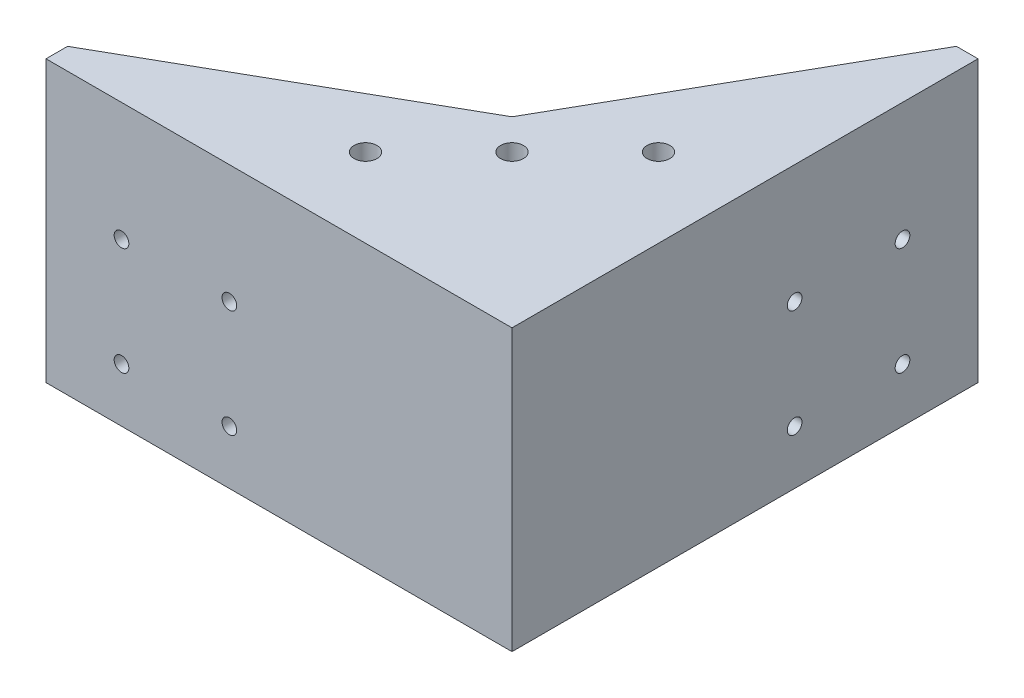
ISO-10303-21;
HEADER;
FILE_DESCRIPTION(('STEP AP214'),'2;1');
FILE_NAME('part.step','',(''),(''),'','','');
FILE_SCHEMA(('AUTOMOTIVE_DESIGN { 1 0 10303 214 1 1 1 1 }'));
ENDSEC;
DATA;
#1=APPLICATION_CONTEXT('core data for automotive mechanical design processes');
#2=APPLICATION_PROTOCOL_DEFINITION('international standard','automotive_design',2000,#1);
#3=PRODUCT_CONTEXT('',#1,'mechanical');
#4=PRODUCT('Part','Part','',(#3));
#5=PRODUCT_RELATED_PRODUCT_CATEGORY('part','',(#4));
#6=PRODUCT_DEFINITION_FORMATION('','',#4);
#7=PRODUCT_DEFINITION_CONTEXT('part definition',#1,'design');
#8=PRODUCT_DEFINITION('design','',#6,#7);
#9=PRODUCT_DEFINITION_SHAPE('','',#8);
#10=(LENGTH_UNIT() NAMED_UNIT(*) SI_UNIT(.MILLI.,.METRE.));
#11=(NAMED_UNIT(*) PLANE_ANGLE_UNIT() SI_UNIT($,.RADIAN.));
#12=(NAMED_UNIT(*) SI_UNIT($,.STERADIAN.) SOLID_ANGLE_UNIT());
#13=UNCERTAINTY_MEASURE_WITH_UNIT(LENGTH_MEASURE(1.E-05),#10,'distance_accuracy_value','');
#14=(GEOMETRIC_REPRESENTATION_CONTEXT(3) GLOBAL_UNCERTAINTY_ASSIGNED_CONTEXT((#13)) GLOBAL_UNIT_ASSIGNED_CONTEXT((#10,
#11,#12)) REPRESENTATION_CONTEXT('',''));
#15=CARTESIAN_POINT('',(0.,0.,0.));
#16=DIRECTION('',(0.,0.,1.));
#17=DIRECTION('',(1.,0.,0.));
#18=AXIS2_PLACEMENT_3D('',#15,#16,#17);
#19=CARTESIAN_POINT('',(0.,60.,49.));
#20=DIRECTION('',(0.,0.,-1.));
#21=DIRECTION('',(-1.,0.,0.));
#22=AXIS2_PLACEMENT_3D('',#19,#20,#21);
#23=PLANE('',#22);
#24=DIRECTION('',(-1.,0.,0.));
#25=VECTOR('',#24,1.);
#26=CARTESIAN_POINT('',(0.,40.,49.));
#27=LINE('',#26,#25);
#28=CARTESIAN_POINT('',(49.,40.,49.));
#29=VERTEX_POINT('',#28);
#30=CARTESIAN_POINT('',(14.,40.,49.));
#31=VERTEX_POINT('',#30);
#32=EDGE_CURVE('E160',#29,#31,#27,.T.);
#33=ORIENTED_EDGE('',*,*,#32,.F.);
#34=DIRECTION('',(0.,-1.,0.));
#35=VECTOR('',#34,1.);
#36=CARTESIAN_POINT('',(49.,60.,49.));
#37=LINE('',#36,#35);
#38=CARTESIAN_POINT('',(49.,0.,49.));
#39=VERTEX_POINT('',#38);
#40=EDGE_CURVE('E139',#29,#39,#37,.T.);
#41=ORIENTED_EDGE('',*,*,#40,.T.);
#42=DIRECTION('',(1.,0.,0.));
#43=VECTOR('',#42,1.);
#44=CARTESIAN_POINT('',(0.,0.,49.));
#45=LINE('',#44,#43);
#46=CARTESIAN_POINT('',(-54.,0.,49.));
#47=VERTEX_POINT('',#46);
#48=EDGE_CURVE('E331',#47,#39,#45,.T.);
#49=ORIENTED_EDGE('',*,*,#48,.F.);
#50=DIRECTION('',(0.,-1.,0.));
#51=VECTOR('',#50,1.);
#52=CARTESIAN_POINT('',(-54.,60.,49.));
#53=LINE('',#52,#51);
#54=CARTESIAN_POINT('',(-54.,60.,49.));
#55=VERTEX_POINT('',#54);
#56=EDGE_CURVE('E149',#55,#47,#53,.T.);
#57=ORIENTED_EDGE('',*,*,#56,.F.);
#58=DIRECTION('',(1.,0.,0.));
#59=VECTOR('',#58,1.);
#60=CARTESIAN_POINT('',(0.,60.,49.));
#61=LINE('',#60,#59);
#62=CARTESIAN_POINT('',(14.,60.,49.));
#63=VERTEX_POINT('',#62);
#64=EDGE_CURVE('E321',#55,#63,#61,.T.);
#65=ORIENTED_EDGE('',*,*,#64,.T.);
#66=DIRECTION('',(0.,1.,0.));
#67=VECTOR('',#66,1.);
#68=CARTESIAN_POINT('',(14.,60.,49.));
#69=LINE('',#68,#67);
#70=EDGE_CURVE('E65',#31,#63,#69,.T.);
#71=ORIENTED_EDGE('',*,*,#70,.F.);
#72=EDGE_LOOP('',(#33,#41,#49,#57,#65,#71));
#73=FACE_BOUND('',#72,.T.);
#74=CARTESIAN_POINT('',(-11.5,37.5,49.));
#75=DIRECTION('',(0.,0.,-1.));
#76=DIRECTION('',(1.,0.,0.));
#77=AXIS2_PLACEMENT_3D('',#74,#75,#76);
#78=CIRCLE('',#77,1.7);
#79=CARTESIAN_POINT('',(-9.79999999999999,37.5,49.));
#80=VERTEX_POINT('',#79);
#81=EDGE_CURVE('E302',#80,#80,#78,.T.);
#82=ORIENTED_EDGE('',*,*,#81,.F.);
#83=EDGE_LOOP('',(#82));
#84=FACE_BOUND('',#83,.T.);
#85=CARTESIAN_POINT('',(-11.5,12.5,49.));
#86=DIRECTION('',(0.,0.,-1.));
#87=DIRECTION('',(-1.,0.,0.));
#88=AXIS2_PLACEMENT_3D('',#85,#86,#87);
#89=CIRCLE('',#88,1.7);
#90=CARTESIAN_POINT('',(-13.2,12.5,49.));
#91=VERTEX_POINT('',#90);
#92=EDGE_CURVE('E294',#91,#91,#89,.T.);
#93=ORIENTED_EDGE('',*,*,#92,.F.);
#94=EDGE_LOOP('',(#93));
#95=FACE_BOUND('',#94,.T.);
#96=CARTESIAN_POINT('',(-36.5,12.5,49.));
#97=DIRECTION('',(0.,0.,-1.));
#98=DIRECTION('',(1.,0.,0.));
#99=AXIS2_PLACEMENT_3D('',#96,#97,#98);
#100=CIRCLE('',#99,1.7);
#101=CARTESIAN_POINT('',(-34.8,12.5,49.));
#102=VERTEX_POINT('',#101);
#103=EDGE_CURVE('E285',#102,#102,#100,.T.);
#104=ORIENTED_EDGE('',*,*,#103,.F.);
#105=EDGE_LOOP('',(#104));
#106=FACE_BOUND('',#105,.T.);
#107=CARTESIAN_POINT('',(-36.5,37.5,49.));
#108=DIRECTION('',(0.,0.,-1.));
#109=DIRECTION('',(-1.,0.,0.));
#110=AXIS2_PLACEMENT_3D('',#107,#108,#109);
#111=CIRCLE('',#110,1.7);
#112=CARTESIAN_POINT('',(-38.2,37.5,49.));
#113=VERTEX_POINT('',#112);
#114=EDGE_CURVE('E289',#113,#113,#111,.T.);
#115=ORIENTED_EDGE('',*,*,#114,.F.);
#116=EDGE_LOOP('',(#115));
#117=FACE_BOUND('',#116,.T.);
#118=ADVANCED_FACE('F49',(#73,#84,#95,#106,#117),#23,.T.);
#119=CARTESIAN_POINT('',(0.,60.,-54.));
#120=DIRECTION('',(0.,0.,-1.));
#121=DIRECTION('',(-1.,0.,0.));
#122=AXIS2_PLACEMENT_3D('',#119,#120,#121);
#123=PLANE('',#122);
#124=DIRECTION('',(1.,0.,0.));
#125=VECTOR('',#124,1.);
#126=CARTESIAN_POINT('',(0.,0.,-54.));
#127=LINE('',#126,#125);
#128=CARTESIAN_POINT('',(49.,0.,-54.));
#129=VERTEX_POINT('',#128);
#130=CARTESIAN_POINT('',(54.,0.,-54.));
#131=VERTEX_POINT('',#130);
#132=EDGE_CURVE('E313',#129,#131,#127,.T.);
#133=ORIENTED_EDGE('',*,*,#132,.F.);
#134=DIRECTION('',(0.,-1.,0.));
#135=VECTOR('',#134,1.);
#136=CARTESIAN_POINT('',(49.,60.,-54.));
#137=LINE('',#136,#135);
#138=CARTESIAN_POINT('',(49.,60.,-54.));
#139=VERTEX_POINT('',#138);
#140=EDGE_CURVE('E58',#139,#129,#137,.T.);
#141=ORIENTED_EDGE('',*,*,#140,.F.);
#142=DIRECTION('',(0.,-1.,0.));
#143=VECTOR('',#142,1.);
#144=CARTESIAN_POINT('',(49.,65.,-54.));
#145=LINE('',#144,#143);
#146=CARTESIAN_POINT('',(49.,65.,-54.));
#147=VERTEX_POINT('',#146);
#148=EDGE_CURVE('E245',#147,#139,#145,.T.);
#149=ORIENTED_EDGE('',*,*,#148,.F.);
#150=DIRECTION('',(-1.,0.,0.));
#151=VECTOR('',#150,1.);
#152=CARTESIAN_POINT('',(54.,65.,-54.));
#153=LINE('',#152,#151);
#154=CARTESIAN_POINT('',(54.,65.,-54.));
#155=VERTEX_POINT('',#154);
#156=EDGE_CURVE('E231',#155,#147,#153,.T.);
#157=ORIENTED_EDGE('',*,*,#156,.F.);
#158=DIRECTION('',(0.,-1.,0.));
#159=VECTOR('',#158,1.);
#160=CARTESIAN_POINT('',(54.,60.,-54.));
#161=LINE('',#160,#159);
#162=EDGE_CURVE('E325',#155,#131,#161,.T.);
#163=ORIENTED_EDGE('',*,*,#162,.T.);
#164=EDGE_LOOP('',(#133,#141,#149,#157,#163));
#165=FACE_BOUND('',#164,.T.);
#166=ADVANCED_FACE('F51',(#165),#123,.T.);
#167=CARTESIAN_POINT('',(49.,60.,0.));
#168=DIRECTION('',(1.,0.,0.));
#169=DIRECTION('',(0.,0.,-1.));
#170=AXIS2_PLACEMENT_3D('',#167,#168,#169);
#171=PLANE('',#170);
#172=CARTESIAN_POINT('',(49.,37.5,-11.5));
#173=DIRECTION('',(-1.,0.,0.));
#174=DIRECTION('',(0.,0.,-1.));
#175=AXIS2_PLACEMENT_3D('',#172,#173,#174);
#176=CIRCLE('',#175,1.7);
#177=CARTESIAN_POINT('',(49.,37.5,-13.2));
#178=VERTEX_POINT('',#177);
#179=EDGE_CURVE('E270',#178,#178,#176,.T.);
#180=ORIENTED_EDGE('',*,*,#179,.F.);
#181=EDGE_LOOP('',(#180));
#182=FACE_BOUND('',#181,.T.);
#183=CARTESIAN_POINT('',(49.,12.5,-11.5));
#184=DIRECTION('',(-1.,0.,0.));
#185=DIRECTION('',(0.,0.,1.));
#186=AXIS2_PLACEMENT_3D('',#183,#184,#185);
#187=CIRCLE('',#186,1.7);
#188=CARTESIAN_POINT('',(49.,12.5,-9.80000000000002));
#189=VERTEX_POINT('',#188);
#190=EDGE_CURVE('E262',#189,#189,#187,.T.);
#191=ORIENTED_EDGE('',*,*,#190,.F.);
#192=EDGE_LOOP('',(#191));
#193=FACE_BOUND('',#192,.T.);
#194=CARTESIAN_POINT('',(49.,12.5,-36.5));
#195=DIRECTION('',(-1.,0.,0.));
#196=DIRECTION('',(0.,0.,-1.));
#197=AXIS2_PLACEMENT_3D('',#194,#195,#196);
#198=CIRCLE('',#197,1.7);
#199=CARTESIAN_POINT('',(49.,12.5,-38.2));
#200=VERTEX_POINT('',#199);
#201=EDGE_CURVE('E253',#200,#200,#198,.T.);
#202=ORIENTED_EDGE('',*,*,#201,.F.);
#203=EDGE_LOOP('',(#202));
#204=FACE_BOUND('',#203,.T.);
#205=CARTESIAN_POINT('',(49.,37.5,-36.5));
#206=DIRECTION('',(-1.,0.,0.));
#207=DIRECTION('',(0.,0.,1.));
#208=AXIS2_PLACEMENT_3D('',#205,#206,#207);
#209=CIRCLE('',#208,1.7);
#210=CARTESIAN_POINT('',(49.,37.5,-34.8));
#211=VERTEX_POINT('',#210);
#212=EDGE_CURVE('E257',#211,#211,#209,.T.);
#213=ORIENTED_EDGE('',*,*,#212,.F.);
#214=EDGE_LOOP('',(#213));
#215=FACE_BOUND('',#214,.T.);
#216=ORIENTED_EDGE('',*,*,#40,.F.);
#217=DIRECTION('',(0.,0.,1.));
#218=VECTOR('',#217,1.);
#219=CARTESIAN_POINT('',(49.,40.,0.));
#220=LINE('',#219,#218);
#221=CARTESIAN_POINT('',(49.,40.,14.));
#222=VERTEX_POINT('',#221);
#223=EDGE_CURVE('E143',#29,#222,#220,.F.);
#224=ORIENTED_EDGE('',*,*,#223,.T.);
#225=DIRECTION('',(0.,1.,0.));
#226=VECTOR('',#225,1.);
#227=CARTESIAN_POINT('',(49.,60.,14.));
#228=LINE('',#227,#226);
#229=CARTESIAN_POINT('',(49.,60.,14.));
#230=VERTEX_POINT('',#229);
#231=EDGE_CURVE('E187',#222,#230,#228,.T.);
#232=ORIENTED_EDGE('',*,*,#231,.T.);
#233=DIRECTION('',(0.,0.,1.));
#234=VECTOR('',#233,1.);
#235=CARTESIAN_POINT('',(49.,60.,0.));
#236=LINE('',#235,#234);
#237=EDGE_CURVE('E317',#139,#230,#236,.T.);
#238=ORIENTED_EDGE('',*,*,#237,.F.);
#239=ORIENTED_EDGE('',*,*,#140,.T.);
#240=DIRECTION('',(0.,0.,1.));
#241=VECTOR('',#240,1.);
#242=CARTESIAN_POINT('',(49.,0.,0.));
#243=LINE('',#242,#241);
#244=EDGE_CURVE('E145',#129,#39,#243,.T.);
#245=ORIENTED_EDGE('',*,*,#244,.T.);
#246=EDGE_LOOP('',(#216,#224,#232,#238,#239,#245));
#247=FACE_BOUND('',#246,.T.);
#248=ADVANCED_FACE('F141',(#182,#193,#204,#215,#247),#171,.F.);
#249=CARTESIAN_POINT('',(-54.,60.,0.));
#250=DIRECTION('',(1.,0.,0.));
#251=DIRECTION('',(0.,0.,-1.));
#252=AXIS2_PLACEMENT_3D('',#249,#250,#251);
#253=PLANE('',#252);
#254=DIRECTION('',(0.,0.,1.));
#255=VECTOR('',#254,1.);
#256=CARTESIAN_POINT('',(-54.,0.,0.));
#257=LINE('',#256,#255);
#258=CARTESIAN_POINT('',(-54.,0.,54.));
#259=VERTEX_POINT('',#258);
#260=EDGE_CURVE('E334',#47,#259,#257,.T.);
#261=ORIENTED_EDGE('',*,*,#260,.T.);
#262=DIRECTION('',(0.,-1.,0.));
#263=VECTOR('',#262,1.);
#264=CARTESIAN_POINT('',(-54.,60.,54.));
#265=LINE('',#264,#263);
#266=CARTESIAN_POINT('',(-54.,65.,54.));
#267=VERTEX_POINT('',#266);
#268=EDGE_CURVE('E349',#267,#259,#265,.T.);
#269=ORIENTED_EDGE('',*,*,#268,.F.);
#270=DIRECTION('',(0.,0.,1.));
#271=VECTOR('',#270,1.);
#272=CARTESIAN_POINT('',(-54.,65.,49.));
#273=LINE('',#272,#271);
#274=CARTESIAN_POINT('',(-54.,65.,49.));
#275=VERTEX_POINT('',#274);
#276=EDGE_CURVE('E220',#275,#267,#273,.T.);
#277=ORIENTED_EDGE('',*,*,#276,.F.);
#278=DIRECTION('',(0.,-1.,0.));
#279=VECTOR('',#278,1.);
#280=CARTESIAN_POINT('',(-54.,65.,49.));
#281=LINE('',#280,#279);
#282=EDGE_CURVE('E248',#275,#55,#281,.T.);
#283=ORIENTED_EDGE('',*,*,#282,.T.);
#284=ORIENTED_EDGE('',*,*,#56,.T.);
#285=EDGE_LOOP('',(#261,#269,#277,#283,#284));
#286=FACE_BOUND('',#285,.T.);
#287=ADVANCED_FACE('F378',(#286),#253,.F.);
#288=CARTESIAN_POINT('',(0.,60.,54.));
#289=DIRECTION('',(0.,0.,-1.));
#290=DIRECTION('',(-1.,0.,0.));
#291=AXIS2_PLACEMENT_3D('',#288,#289,#290);
#292=PLANE('',#291);
#293=DIRECTION('',(0.,-1.,0.));
#294=VECTOR('',#293,1.);
#295=CARTESIAN_POINT('',(54.,60.,54.));
#296=LINE('',#295,#294);
#297=CARTESIAN_POINT('',(54.,65.,54.));
#298=VERTEX_POINT('',#297);
#299=CARTESIAN_POINT('',(54.,0.,54.));
#300=VERTEX_POINT('',#299);
#301=EDGE_CURVE('E346',#298,#300,#296,.T.);
#302=ORIENTED_EDGE('',*,*,#301,.F.);
#303=DIRECTION('',(1.,0.,0.));
#304=VECTOR('',#303,1.);
#305=CARTESIAN_POINT('',(-54.,65.,54.));
#306=LINE('',#305,#304);
#307=EDGE_CURVE('E225',#267,#298,#306,.T.);
#308=ORIENTED_EDGE('',*,*,#307,.F.);
#309=ORIENTED_EDGE('',*,*,#268,.T.);
#310=DIRECTION('',(1.,0.,0.));
#311=VECTOR('',#310,1.);
#312=CARTESIAN_POINT('',(0.,0.,54.));
#313=LINE('',#312,#311);
#314=EDGE_CURVE('E337',#259,#300,#313,.T.);
#315=ORIENTED_EDGE('',*,*,#314,.T.);
#316=EDGE_LOOP('',(#302,#308,#309,#315));
#317=FACE_BOUND('',#316,.T.);
#318=CARTESIAN_POINT('',(-11.5,37.5,54.));
#319=DIRECTION('',(0.,0.,-1.));
#320=DIRECTION('',(1.,0.,0.));
#321=AXIS2_PLACEMENT_3D('',#318,#319,#320);
#322=CIRCLE('',#321,1.7);
#323=CARTESIAN_POINT('',(-9.79999999999999,37.5,54.));
#324=VERTEX_POINT('',#323);
#325=EDGE_CURVE('E281',#324,#324,#322,.T.);
#326=ORIENTED_EDGE('',*,*,#325,.T.);
#327=EDGE_LOOP('',(#326));
#328=FACE_BOUND('',#327,.T.);
#329=CARTESIAN_POINT('',(-11.5,12.5,54.));
#330=DIRECTION('',(0.,0.,-1.));
#331=DIRECTION('',(-1.,0.,0.));
#332=AXIS2_PLACEMENT_3D('',#329,#330,#331);
#333=CIRCLE('',#332,1.7);
#334=CARTESIAN_POINT('',(-13.2,12.5,54.));
#335=VERTEX_POINT('',#334);
#336=EDGE_CURVE('E298',#335,#335,#333,.T.);
#337=ORIENTED_EDGE('',*,*,#336,.T.);
#338=EDGE_LOOP('',(#337));
#339=FACE_BOUND('',#338,.T.);
#340=CARTESIAN_POINT('',(-36.5,12.5,54.));
#341=DIRECTION('',(0.,0.,-1.));
#342=DIRECTION('',(1.,0.,0.));
#343=AXIS2_PLACEMENT_3D('',#340,#341,#342);
#344=CIRCLE('',#343,1.7);
#345=CARTESIAN_POINT('',(-34.8,12.5,54.));
#346=VERTEX_POINT('',#345);
#347=EDGE_CURVE('E290',#346,#346,#344,.T.);
#348=ORIENTED_EDGE('',*,*,#347,.T.);
#349=EDGE_LOOP('',(#348));
#350=FACE_BOUND('',#349,.T.);
#351=CARTESIAN_POINT('',(-36.5,37.5,54.));
#352=DIRECTION('',(0.,0.,-1.));
#353=DIRECTION('',(-1.,0.,0.));
#354=AXIS2_PLACEMENT_3D('',#351,#352,#353);
#355=CIRCLE('',#354,1.7);
#356=CARTESIAN_POINT('',(-38.2,37.5,54.));
#357=VERTEX_POINT('',#356);
#358=EDGE_CURVE('E309',#357,#357,#355,.T.);
#359=ORIENTED_EDGE('',*,*,#358,.T.);
#360=EDGE_LOOP('',(#359));
#361=FACE_BOUND('',#360,.T.);
#362=ADVANCED_FACE('F374',(#317,#328,#339,#350,#361),#292,.F.);
#363=CARTESIAN_POINT('',(54.,60.,0.));
#364=DIRECTION('',(1.,0.,0.));
#365=DIRECTION('',(0.,0.,-1.));
#366=AXIS2_PLACEMENT_3D('',#363,#364,#365);
#367=PLANE('',#366);
#368=ORIENTED_EDGE('',*,*,#162,.F.);
#369=DIRECTION('',(0.,0.,-1.));
#370=VECTOR('',#369,1.);
#371=CARTESIAN_POINT('',(54.,65.,54.));
#372=LINE('',#371,#370);
#373=EDGE_CURVE('E228',#298,#155,#372,.T.);
#374=ORIENTED_EDGE('',*,*,#373,.F.);
#375=ORIENTED_EDGE('',*,*,#301,.T.);
#376=DIRECTION('',(0.,0.,1.));
#377=VECTOR('',#376,1.);
#378=CARTESIAN_POINT('',(54.,0.,0.));
#379=LINE('',#378,#377);
#380=EDGE_CURVE('E322',#131,#300,#379,.T.);
#381=ORIENTED_EDGE('',*,*,#380,.F.);
#382=EDGE_LOOP('',(#368,#374,#375,#381));
#383=FACE_BOUND('',#382,.T.);
#384=CARTESIAN_POINT('',(54.,37.5,-11.5));
#385=DIRECTION('',(-1.,0.,0.));
#386=DIRECTION('',(0.,0.,-1.));
#387=AXIS2_PLACEMENT_3D('',#384,#385,#386);
#388=CIRCLE('',#387,1.7);
#389=CARTESIAN_POINT('',(54.,37.5,-13.2));
#390=VERTEX_POINT('',#389);
#391=EDGE_CURVE('E252',#390,#390,#388,.T.);
#392=ORIENTED_EDGE('',*,*,#391,.T.);
#393=EDGE_LOOP('',(#392));
#394=FACE_BOUND('',#393,.T.);
#395=CARTESIAN_POINT('',(54.,12.5,-11.5));
#396=DIRECTION('',(-1.,0.,0.));
#397=DIRECTION('',(0.,0.,1.));
#398=AXIS2_PLACEMENT_3D('',#395,#396,#397);
#399=CIRCLE('',#398,1.7);
#400=CARTESIAN_POINT('',(54.,12.5,-9.80000000000002));
#401=VERTEX_POINT('',#400);
#402=EDGE_CURVE('E266',#401,#401,#399,.T.);
#403=ORIENTED_EDGE('',*,*,#402,.T.);
#404=EDGE_LOOP('',(#403));
#405=FACE_BOUND('',#404,.T.);
#406=CARTESIAN_POINT('',(54.,12.5,-36.5));
#407=DIRECTION('',(-1.,0.,0.));
#408=DIRECTION('',(0.,0.,-1.));
#409=AXIS2_PLACEMENT_3D('',#406,#407,#408);
#410=CIRCLE('',#409,1.7);
#411=CARTESIAN_POINT('',(54.,12.5,-38.2));
#412=VERTEX_POINT('',#411);
#413=EDGE_CURVE('E258',#412,#412,#410,.T.);
#414=ORIENTED_EDGE('',*,*,#413,.T.);
#415=EDGE_LOOP('',(#414));
#416=FACE_BOUND('',#415,.T.);
#417=CARTESIAN_POINT('',(54.,37.5,-36.5));
#418=DIRECTION('',(-1.,0.,0.));
#419=DIRECTION('',(0.,0.,1.));
#420=AXIS2_PLACEMENT_3D('',#417,#418,#419);
#421=CIRCLE('',#420,1.7);
#422=CARTESIAN_POINT('',(54.,37.5,-34.8));
#423=VERTEX_POINT('',#422);
#424=EDGE_CURVE('E277',#423,#423,#421,.T.);
#425=ORIENTED_EDGE('',*,*,#424,.T.);
#426=EDGE_LOOP('',(#425));
#427=FACE_BOUND('',#426,.T.);
#428=ADVANCED_FACE('F369',(#383,#394,#405,#416,#427),#367,.T.);
#429=CARTESIAN_POINT('',(0.,0.,0.));
#430=DIRECTION('',(0.,1.,0.));
#431=DIRECTION('',(0.,0.,1.));
#432=AXIS2_PLACEMENT_3D('',#429,#430,#431);
#433=PLANE('',#432);
#434=ORIENTED_EDGE('',*,*,#132,.T.);
#435=ORIENTED_EDGE('',*,*,#380,.T.);
#436=ORIENTED_EDGE('',*,*,#314,.F.);
#437=ORIENTED_EDGE('',*,*,#260,.F.);
#438=ORIENTED_EDGE('',*,*,#48,.T.);
#439=ORIENTED_EDGE('',*,*,#244,.F.);
#440=EDGE_LOOP('',(#434,#435,#436,#437,#438,#439));
#441=FACE_BOUND('',#440,.T.);
#442=ADVANCED_FACE('F362',(#441),#433,.F.);
#443=CARTESIAN_POINT('',(-36.5,37.5,54.));
#444=DIRECTION('',(0.,0.,-1.));
#445=DIRECTION('',(-1.,0.,0.));
#446=AXIS2_PLACEMENT_3D('',#443,#444,#445);
#447=CYLINDRICAL_SURFACE('',#446,1.7);
#448=ORIENTED_EDGE('',*,*,#358,.F.);
#449=EDGE_LOOP('',(#448));
#450=FACE_BOUND('',#449,.T.);
#451=ORIENTED_EDGE('',*,*,#114,.T.);
#452=EDGE_LOOP('',(#451));
#453=FACE_BOUND('',#452,.T.);
#454=ADVANCED_FACE('F448',(#450,#453),#447,.F.);
#455=CARTESIAN_POINT('',(-36.5,12.5,54.));
#456=DIRECTION('',(0.,0.,-1.));
#457=DIRECTION('',(-1.,0.,0.));
#458=AXIS2_PLACEMENT_3D('',#455,#456,#457);
#459=CYLINDRICAL_SURFACE('',#458,1.7);
#460=ORIENTED_EDGE('',*,*,#347,.F.);
#461=EDGE_LOOP('',(#460));
#462=FACE_BOUND('',#461,.T.);
#463=ORIENTED_EDGE('',*,*,#103,.T.);
#464=EDGE_LOOP('',(#463));
#465=FACE_BOUND('',#464,.T.);
#466=ADVANCED_FACE('F445',(#462,#465),#459,.F.);
#467=CARTESIAN_POINT('',(-11.5,12.5,54.));
#468=DIRECTION('',(0.,0.,-1.));
#469=DIRECTION('',(-1.,0.,0.));
#470=AXIS2_PLACEMENT_3D('',#467,#468,#469);
#471=CYLINDRICAL_SURFACE('',#470,1.7);
#472=ORIENTED_EDGE('',*,*,#336,.F.);
#473=EDGE_LOOP('',(#472));
#474=FACE_BOUND('',#473,.T.);
#475=ORIENTED_EDGE('',*,*,#92,.T.);
#476=EDGE_LOOP('',(#475));
#477=FACE_BOUND('',#476,.T.);
#478=ADVANCED_FACE('F439',(#474,#477),#471,.F.);
#479=CARTESIAN_POINT('',(-11.5,37.5,54.));
#480=DIRECTION('',(0.,0.,-1.));
#481=DIRECTION('',(-1.,0.,0.));
#482=AXIS2_PLACEMENT_3D('',#479,#480,#481);
#483=CYLINDRICAL_SURFACE('',#482,1.7);
#484=ORIENTED_EDGE('',*,*,#325,.F.);
#485=EDGE_LOOP('',(#484));
#486=FACE_BOUND('',#485,.T.);
#487=ORIENTED_EDGE('',*,*,#81,.T.);
#488=EDGE_LOOP('',(#487));
#489=FACE_BOUND('',#488,.T.);
#490=ADVANCED_FACE('F430',(#486,#489),#483,.F.);
#491=CARTESIAN_POINT('',(54.,37.5,-36.5));
#492=DIRECTION('',(-1.,0.,0.));
#493=DIRECTION('',(0.,0.,1.));
#494=AXIS2_PLACEMENT_3D('',#491,#492,#493);
#495=CYLINDRICAL_SURFACE('',#494,1.7);
#496=ORIENTED_EDGE('',*,*,#424,.F.);
#497=EDGE_LOOP('',(#496));
#498=FACE_BOUND('',#497,.T.);
#499=ORIENTED_EDGE('',*,*,#212,.T.);
#500=EDGE_LOOP('',(#499));
#501=FACE_BOUND('',#500,.T.);
#502=ADVANCED_FACE('F427',(#498,#501),#495,.F.);
#503=CARTESIAN_POINT('',(54.,12.5,-36.5));
#504=DIRECTION('',(-1.,0.,0.));
#505=DIRECTION('',(0.,0.,1.));
#506=AXIS2_PLACEMENT_3D('',#503,#504,#505);
#507=CYLINDRICAL_SURFACE('',#506,1.7);
#508=ORIENTED_EDGE('',*,*,#413,.F.);
#509=EDGE_LOOP('',(#508));
#510=FACE_BOUND('',#509,.T.);
#511=ORIENTED_EDGE('',*,*,#201,.T.);
#512=EDGE_LOOP('',(#511));
#513=FACE_BOUND('',#512,.T.);
#514=ADVANCED_FACE('F429',(#510,#513),#507,.F.);
#515=CARTESIAN_POINT('',(54.,12.5,-11.5));
#516=DIRECTION('',(-1.,0.,0.));
#517=DIRECTION('',(0.,0.,1.));
#518=AXIS2_PLACEMENT_3D('',#515,#516,#517);
#519=CYLINDRICAL_SURFACE('',#518,1.7);
#520=ORIENTED_EDGE('',*,*,#402,.F.);
#521=EDGE_LOOP('',(#520));
#522=FACE_BOUND('',#521,.T.);
#523=ORIENTED_EDGE('',*,*,#190,.T.);
#524=EDGE_LOOP('',(#523));
#525=FACE_BOUND('',#524,.T.);
#526=ADVANCED_FACE('F402',(#522,#525),#519,.F.);
#527=CARTESIAN_POINT('',(54.,37.5,-11.5));
#528=DIRECTION('',(-1.,0.,0.));
#529=DIRECTION('',(0.,0.,1.));
#530=AXIS2_PLACEMENT_3D('',#527,#528,#529);
#531=CYLINDRICAL_SURFACE('',#530,1.7);
#532=ORIENTED_EDGE('',*,*,#391,.F.);
#533=EDGE_LOOP('',(#532));
#534=FACE_BOUND('',#533,.T.);
#535=ORIENTED_EDGE('',*,*,#179,.T.);
#536=EDGE_LOOP('',(#535));
#537=FACE_BOUND('',#536,.T.);
#538=ADVANCED_FACE('F394',(#534,#537),#531,.F.);
#539=CARTESIAN_POINT('',(0.,60.,0.));
#540=DIRECTION('',(0.,1.,0.));
#541=DIRECTION('',(0.,0.,1.));
#542=AXIS2_PLACEMENT_3D('',#539,#540,#541);
#543=PLANE('',#542);
#544=CARTESIAN_POINT('',(1.74264068711929,60.,35.6837661840736));
#545=DIRECTION('',(0.,1.,0.));
#546=DIRECTION('',(0.,0.,1.));
#547=AXIS2_PLACEMENT_3D('',#544,#545,#546);
#548=CIRCLE('',#547,2.65);
#549=CARTESIAN_POINT('',(1.74264068711929,60.,38.3337661840736));
#550=VERTEX_POINT('',#549);
#551=EDGE_CURVE('E204',#550,#550,#548,.T.);
#552=ORIENTED_EDGE('',*,*,#551,.T.);
#553=EDGE_LOOP('',(#552));
#554=FACE_BOUND('',#553,.T.);
#555=CARTESIAN_POINT('',(35.6837661840736,60.,1.74264068711929));
#556=DIRECTION('',(0.,1.,0.));
#557=DIRECTION('',(0.,0.,-1.));
#558=AXIS2_PLACEMENT_3D('',#555,#556,#557);
#559=CIRCLE('',#558,2.65);
#560=CARTESIAN_POINT('',(35.6837661840736,60.,-0.907359312880711));
#561=VERTEX_POINT('',#560);
#562=EDGE_CURVE('E196',#561,#561,#559,.T.);
#563=ORIENTED_EDGE('',*,*,#562,.T.);
#564=EDGE_LOOP('',(#563));
#565=FACE_BOUND('',#564,.T.);
#566=CARTESIAN_POINT('',(18.7132034355964,60.,18.7132034355964));
#567=DIRECTION('',(0.,1.,0.));
#568=DIRECTION('',(0.,0.,1.));
#569=AXIS2_PLACEMENT_3D('',#566,#567,#568);
#570=CIRCLE('',#569,2.65);
#571=CARTESIAN_POINT('',(18.7132034355964,60.,21.3632034355964));
#572=VERTEX_POINT('',#571);
#573=EDGE_CURVE('E157',#572,#572,#570,.T.);
#574=ORIENTED_EDGE('',*,*,#573,.T.);
#575=EDGE_LOOP('',(#574));
#576=FACE_BOUND('',#575,.T.);
#577=DIRECTION('',(0.,0.,-1.));
#578=VECTOR('',#577,1.);
#579=CARTESIAN_POINT('',(30.3210678118655,60.,0.));
#580=LINE('',#579,#578);
#581=CARTESIAN_POINT('',(30.3210678118655,60.,14.));
#582=VERTEX_POINT('',#581);
#583=CARTESIAN_POINT('',(30.3210678118655,60.,29.));
#584=VERTEX_POINT('',#583);
#585=EDGE_CURVE('E158',#582,#584,#580,.F.);
#586=ORIENTED_EDGE('',*,*,#585,.T.);
#587=DIRECTION('',(-1.,0.,0.));
#588=VECTOR('',#587,1.);
#589=CARTESIAN_POINT('',(0.,60.,29.));
#590=LINE('',#589,#588);
#591=CARTESIAN_POINT('',(14.,60.,29.));
#592=VERTEX_POINT('',#591);
#593=EDGE_CURVE('E73',#584,#592,#590,.T.);
#594=ORIENTED_EDGE('',*,*,#593,.T.);
#595=DIRECTION('',(0.,0.,1.));
#596=VECTOR('',#595,1.);
#597=CARTESIAN_POINT('',(14.,60.,0.));
#598=LINE('',#597,#596);
#599=EDGE_CURVE('E166',#592,#63,#598,.T.);
#600=ORIENTED_EDGE('',*,*,#599,.T.);
#601=ORIENTED_EDGE('',*,*,#64,.F.);
#602=DIRECTION('',(-0.869108324813539,0.,0.494621794646985));
#603=VECTOR('',#602,1.);
#604=CARTESIAN_POINT('',(-54.,60.,49.));
#605=LINE('',#604,#603);
#606=CARTESIAN_POINT('',(11.6421356237309,60.,11.6421356237309));
#607=VERTEX_POINT('',#606);
#608=EDGE_CURVE('E212',#607,#55,#605,.T.);
#609=ORIENTED_EDGE('',*,*,#608,.F.);
#610=DIRECTION('',(-0.494621794646985,0.,0.869108324813539));
#611=VECTOR('',#610,1.);
#612=CARTESIAN_POINT('',(11.6421356237309,60.,11.6421356237309));
#613=LINE('',#612,#611);
#614=EDGE_CURVE('E221',#139,#607,#613,.T.);
#615=ORIENTED_EDGE('',*,*,#614,.F.);
#616=ORIENTED_EDGE('',*,*,#237,.T.);
#617=DIRECTION('',(-1.,0.,0.));
#618=VECTOR('',#617,1.);
#619=CARTESIAN_POINT('',(0.,60.,14.));
#620=LINE('',#619,#618);
#621=EDGE_CURVE('E183',#230,#582,#620,.T.);
#622=ORIENTED_EDGE('',*,*,#621,.T.);
#623=EDGE_LOOP('',(#586,#594,#600,#601,#609,#615,#616,#622));
#624=FACE_BOUND('',#623,.T.);
#625=ADVANCED_FACE('F392',(#554,#565,#576,#624),#543,.F.);
#626=CARTESIAN_POINT('',(0.,65.,0.));
#627=DIRECTION('',(0.,1.,0.));
#628=DIRECTION('',(0.,0.,1.));
#629=AXIS2_PLACEMENT_3D('',#626,#627,#628);
#630=PLANE('',#629);
#631=ORIENTED_EDGE('',*,*,#307,.T.);
#632=ORIENTED_EDGE('',*,*,#373,.T.);
#633=ORIENTED_EDGE('',*,*,#156,.T.);
#634=DIRECTION('',(-0.494621794646985,0.,0.869108324813539));
#635=VECTOR('',#634,1.);
#636=CARTESIAN_POINT('',(11.6421356237309,65.,11.6421356237309));
#637=LINE('',#636,#635);
#638=CARTESIAN_POINT('',(11.6421356237309,65.,11.6421356237309));
#639=VERTEX_POINT('',#638);
#640=EDGE_CURVE('E234',#147,#639,#637,.T.);
#641=ORIENTED_EDGE('',*,*,#640,.T.);
#642=DIRECTION('',(-0.869108324813539,0.,0.494621794646985));
#643=VECTOR('',#642,1.);
#644=CARTESIAN_POINT('',(-54.,65.,49.));
#645=LINE('',#644,#643);
#646=EDGE_CURVE('E216',#639,#275,#645,.T.);
#647=ORIENTED_EDGE('',*,*,#646,.T.);
#648=ORIENTED_EDGE('',*,*,#276,.T.);
#649=EDGE_LOOP('',(#631,#632,#633,#641,#647,#648));
#650=FACE_BOUND('',#649,.T.);
#651=CARTESIAN_POINT('',(35.6837661840736,65.,1.74264068711929));
#652=DIRECTION('',(0.,1.,0.));
#653=DIRECTION('',(0.,0.,-1.));
#654=AXIS2_PLACEMENT_3D('',#651,#652,#653);
#655=CIRCLE('',#654,2.65);
#656=CARTESIAN_POINT('',(35.6837661840736,65.,-0.907359312880711));
#657=VERTEX_POINT('',#656);
#658=EDGE_CURVE('E200',#657,#657,#655,.T.);
#659=ORIENTED_EDGE('',*,*,#658,.F.);
#660=EDGE_LOOP('',(#659));
#661=FACE_BOUND('',#660,.T.);
#662=CARTESIAN_POINT('',(1.74264068711929,65.,35.6837661840736));
#663=DIRECTION('',(0.,1.,0.));
#664=DIRECTION('',(0.,0.,1.));
#665=AXIS2_PLACEMENT_3D('',#662,#663,#664);
#666=CIRCLE('',#665,2.65);
#667=CARTESIAN_POINT('',(1.74264068711929,65.,38.3337661840736));
#668=VERTEX_POINT('',#667);
#669=EDGE_CURVE('E208',#668,#668,#666,.T.);
#670=ORIENTED_EDGE('',*,*,#669,.F.);
#671=EDGE_LOOP('',(#670));
#672=FACE_BOUND('',#671,.T.);
#673=CARTESIAN_POINT('',(18.7132034355964,65.,18.7132034355964));
#674=DIRECTION('',(0.,1.,0.));
#675=DIRECTION('',(0.,0.,1.));
#676=AXIS2_PLACEMENT_3D('',#673,#674,#675);
#677=CIRCLE('',#676,2.65);
#678=CARTESIAN_POINT('',(18.7132034355964,65.,21.3632034355964));
#679=VERTEX_POINT('',#678);
#680=EDGE_CURVE('E192',#679,#679,#677,.T.);
#681=ORIENTED_EDGE('',*,*,#680,.F.);
#682=EDGE_LOOP('',(#681));
#683=FACE_BOUND('',#682,.T.);
#684=ADVANCED_FACE('F380',(#650,#661,#672,#683),#630,.T.);
#685=CARTESIAN_POINT('',(-54.,65.,49.));
#686=DIRECTION('',(0.494621794646985,0.,0.869108324813539));
#687=DIRECTION('',(0.869108324813539,0.,-0.494621794646985));
#688=AXIS2_PLACEMENT_3D('',#685,#686,#687);
#689=PLANE('',#688);
#690=ORIENTED_EDGE('',*,*,#608,.T.);
#691=ORIENTED_EDGE('',*,*,#282,.F.);
#692=ORIENTED_EDGE('',*,*,#646,.F.);
#693=DIRECTION('',(0.,-1.,0.));
#694=VECTOR('',#693,1.);
#695=CARTESIAN_POINT('',(11.6421356237309,65.,11.6421356237309));
#696=LINE('',#695,#694);
#697=EDGE_CURVE('E237',#639,#607,#696,.T.);
#698=ORIENTED_EDGE('',*,*,#697,.T.);
#699=EDGE_LOOP('',(#690,#691,#692,#698));
#700=FACE_BOUND('',#699,.T.);
#701=ADVANCED_FACE('F387',(#700),#689,.F.);
#702=CARTESIAN_POINT('',(11.6421356237309,65.,11.6421356237309));
#703=DIRECTION('',(0.869108324813539,0.,0.494621794646985));
#704=DIRECTION('',(0.494621794646985,0.,-0.869108324813539));
#705=AXIS2_PLACEMENT_3D('',#702,#703,#704);
#706=PLANE('',#705);
#707=ORIENTED_EDGE('',*,*,#614,.T.);
#708=ORIENTED_EDGE('',*,*,#697,.F.);
#709=ORIENTED_EDGE('',*,*,#640,.F.);
#710=ORIENTED_EDGE('',*,*,#148,.T.);
#711=EDGE_LOOP('',(#707,#708,#709,#710));
#712=FACE_BOUND('',#711,.T.);
#713=ADVANCED_FACE('F519',(#712),#706,.F.);
#714=CARTESIAN_POINT('',(1.74264068711929,65.,35.6837661840736));
#715=DIRECTION('',(0.,-1.,0.));
#716=DIRECTION('',(0.,0.,-1.));
#717=AXIS2_PLACEMENT_3D('',#714,#715,#716);
#718=CYLINDRICAL_SURFACE('',#717,2.65);
#719=ORIENTED_EDGE('',*,*,#669,.T.);
#720=EDGE_LOOP('',(#719));
#721=FACE_BOUND('',#720,.T.);
#722=ORIENTED_EDGE('',*,*,#551,.F.);
#723=EDGE_LOOP('',(#722));
#724=FACE_BOUND('',#723,.T.);
#725=ADVANCED_FACE('F528',(#721,#724),#718,.F.);
#726=CARTESIAN_POINT('',(35.6837661840736,65.,1.74264068711929));
#727=DIRECTION('',(0.,-1.,0.));
#728=DIRECTION('',(0.,0.,-1.));
#729=AXIS2_PLACEMENT_3D('',#726,#727,#728);
#730=CYLINDRICAL_SURFACE('',#729,2.65);
#731=ORIENTED_EDGE('',*,*,#658,.T.);
#732=EDGE_LOOP('',(#731));
#733=FACE_BOUND('',#732,.T.);
#734=ORIENTED_EDGE('',*,*,#562,.F.);
#735=EDGE_LOOP('',(#734));
#736=FACE_BOUND('',#735,.T.);
#737=ADVANCED_FACE('F536',(#733,#736),#730,.F.);
#738=CARTESIAN_POINT('',(18.7132034355964,65.,18.7132034355964));
#739=DIRECTION('',(0.,-1.,0.));
#740=DIRECTION('',(0.,0.,-1.));
#741=AXIS2_PLACEMENT_3D('',#738,#739,#740);
#742=CYLINDRICAL_SURFACE('',#741,2.65);
#743=ORIENTED_EDGE('',*,*,#680,.T.);
#744=EDGE_LOOP('',(#743));
#745=FACE_BOUND('',#744,.T.);
#746=ORIENTED_EDGE('',*,*,#573,.F.);
#747=EDGE_LOOP('',(#746));
#748=FACE_BOUND('',#747,.T.);
#749=ADVANCED_FACE('F545',(#745,#748),#742,.F.);
#750=CARTESIAN_POINT('',(30.3210678118655,60.,14.));
#751=DIRECTION('',(0.730831660519766,0.682557751389523,0.));
#752=DIRECTION('',(0.682557751389523,-0.730831660519766,0.));
#753=AXIS2_PLACEMENT_3D('',#750,#751,#752);
#754=PLANE('',#753);
#755=DIRECTION('',(-0.551074679527139,0.59004944605688,-0.590049446056879));
#756=VECTOR('',#755,1.);
#757=CARTESIAN_POINT('',(25.4436481710011,65.2223752318805,23.7776247681195));
#758=LINE('',#757,#756);
#759=EDGE_CURVE('E11',#584,#29,#758,.F.);
#760=ORIENTED_EDGE('',*,*,#759,.F.);
#761=ORIENTED_EDGE('',*,*,#585,.F.);
#762=DIRECTION('',(0.682557751389523,-0.730831660519766,0.));
#763=VECTOR('',#762,1.);
#764=CARTESIAN_POINT('',(30.3210678118655,60.,14.));
#765=LINE('',#764,#763);
#766=EDGE_CURVE('E155',#582,#222,#765,.T.);
#767=ORIENTED_EDGE('',*,*,#766,.T.);
#768=ORIENTED_EDGE('',*,*,#223,.F.);
#769=EDGE_LOOP('',(#760,#761,#767,#768));
#770=FACE_BOUND('',#769,.T.);
#771=ADVANCED_FACE('F153',(#770),#754,.F.);
#772=CARTESIAN_POINT('',(0.,32.5,14.));
#773=DIRECTION('',(0.,0.,-1.));
#774=DIRECTION('',(-1.,0.,0.));
#775=AXIS2_PLACEMENT_3D('',#772,#773,#774);
#776=PLANE('',#775);
#777=ORIENTED_EDGE('',*,*,#231,.F.);
#778=ORIENTED_EDGE('',*,*,#766,.F.);
#779=ORIENTED_EDGE('',*,*,#621,.F.);
#780=EDGE_LOOP('',(#777,#778,#779));
#781=FACE_BOUND('',#780,.T.);
#782=ADVANCED_FACE('F562',(#781),#776,.T.);
#783=CARTESIAN_POINT('',(14.,60.,29.));
#784=DIRECTION('',(0.,-0.707106781186548,-0.707106781186548));
#785=DIRECTION('',(0.,-0.707106781186548,0.707106781186548));
#786=AXIS2_PLACEMENT_3D('',#783,#784,#785);
#787=PLANE('',#786);
#788=ORIENTED_EDGE('',*,*,#759,.T.);
#789=ORIENTED_EDGE('',*,*,#32,.T.);
#790=DIRECTION('',(0.,-0.707106781186548,0.707106781186548));
#791=VECTOR('',#790,1.);
#792=CARTESIAN_POINT('',(14.,60.,29.));
#793=LINE('',#792,#791);
#794=EDGE_CURVE('E169',#592,#31,#793,.T.);
#795=ORIENTED_EDGE('',*,*,#794,.F.);
#796=ORIENTED_EDGE('',*,*,#593,.F.);
#797=EDGE_LOOP('',(#788,#789,#795,#796));
#798=FACE_BOUND('',#797,.T.);
#799=ADVANCED_FACE('F168',(#798),#787,.T.);
#800=CARTESIAN_POINT('',(14.,32.5,0.));
#801=DIRECTION('',(-1.,0.,0.));
#802=DIRECTION('',(0.,0.,1.));
#803=AXIS2_PLACEMENT_3D('',#800,#801,#802);
#804=PLANE('',#803);
#805=ORIENTED_EDGE('',*,*,#794,.T.);
#806=ORIENTED_EDGE('',*,*,#70,.T.);
#807=ORIENTED_EDGE('',*,*,#599,.F.);
#808=EDGE_LOOP('',(#805,#806,#807));
#809=FACE_BOUND('',#808,.T.);
#810=ADVANCED_FACE('F391',(#809),#804,.T.);
#811=CLOSED_SHELL('',(#118,#166,#248,#287,#362,#428,#442,#454,#466,#478,#490,#502,#514,#526,
#538,#625,#684,#701,#713,#725,#737,#749,#771,#782,#799,#810));
#812=MANIFOLD_SOLID_BREP('B2',#811);
#813=ADVANCED_BREP_SHAPE_REPRESENTATION('',(#18,#812),#14);
#814=SHAPE_DEFINITION_REPRESENTATION(#9,#813);
ENDSEC;
END-ISO-10303-21;
